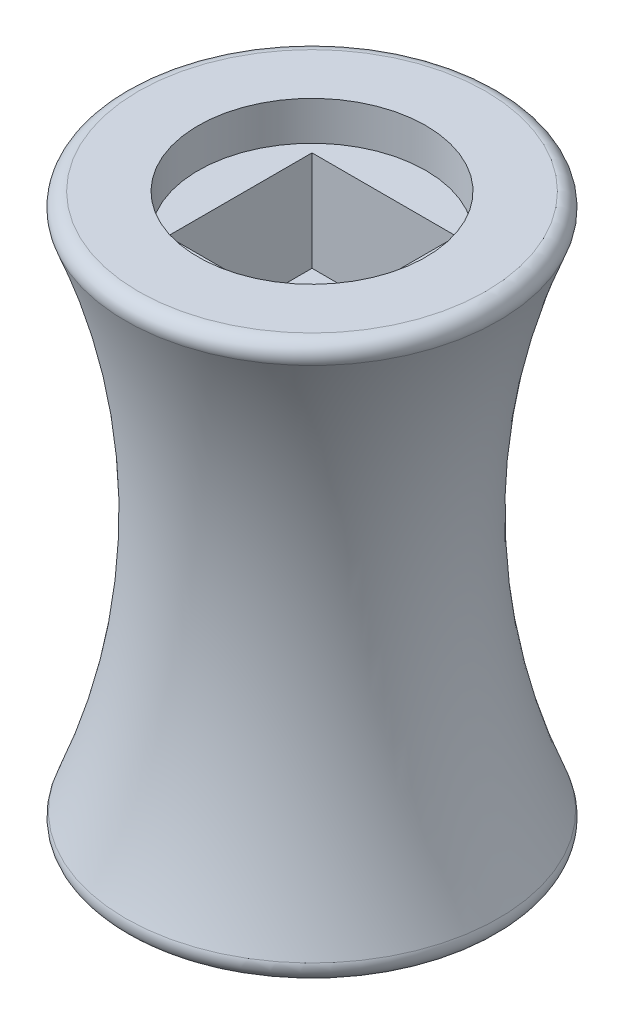
ISO-10303-21;
HEADER;
FILE_DESCRIPTION(('STEP AP214'),'2;1');
FILE_NAME('part.step','',(''),(''),'','','');
FILE_SCHEMA(('AUTOMOTIVE_DESIGN { 1 0 10303 214 1 1 1 1 }'));
ENDSEC;
DATA;
#1=APPLICATION_CONTEXT('core data for automotive mechanical design processes');
#2=APPLICATION_PROTOCOL_DEFINITION('international standard','automotive_design',2000,#1);
#3=PRODUCT_CONTEXT('',#1,'mechanical');
#4=PRODUCT('Part','Part','',(#3));
#5=PRODUCT_RELATED_PRODUCT_CATEGORY('part','',(#4));
#6=PRODUCT_DEFINITION_FORMATION('','',#4);
#7=PRODUCT_DEFINITION_CONTEXT('part definition',#1,'design');
#8=PRODUCT_DEFINITION('design','',#6,#7);
#9=PRODUCT_DEFINITION_SHAPE('','',#8);
#10=(LENGTH_UNIT() NAMED_UNIT(*) SI_UNIT(.MILLI.,.METRE.));
#11=(NAMED_UNIT(*) PLANE_ANGLE_UNIT() SI_UNIT($,.RADIAN.));
#12=(NAMED_UNIT(*) SI_UNIT($,.STERADIAN.) SOLID_ANGLE_UNIT());
#13=UNCERTAINTY_MEASURE_WITH_UNIT(LENGTH_MEASURE(1.E-05),#10,'distance_accuracy_value','');
#14=(GEOMETRIC_REPRESENTATION_CONTEXT(3) GLOBAL_UNCERTAINTY_ASSIGNED_CONTEXT((#13)) GLOBAL_UNIT_ASSIGNED_CONTEXT((#10,
#11,#12)) REPRESENTATION_CONTEXT('',''));
#15=CARTESIAN_POINT('',(0.,0.,0.));
#16=DIRECTION('',(0.,0.,1.));
#17=DIRECTION('',(1.,0.,0.));
#18=AXIS2_PLACEMENT_3D('',#15,#16,#17);
#19=CARTESIAN_POINT('',(3.302,25.4,-3.302));
#20=DIRECTION('',(1.,0.,0.));
#21=DIRECTION('',(0.,0.,-1.));
#22=AXIS2_PLACEMENT_3D('',#19,#20,#21);
#23=PLANE('',#22);
#24=DIRECTION('',(0.,0.,1.));
#25=VECTOR('',#24,1.);
#26=CARTESIAN_POINT('',(3.302,19.05,3.302));
#27=LINE('',#26,#25);
#28=CARTESIAN_POINT('',(3.302,19.05,-3.302));
#29=VERTEX_POINT('',#28);
#30=CARTESIAN_POINT('',(3.302,19.05,3.302));
#31=VERTEX_POINT('',#30);
#32=EDGE_CURVE('E269',#29,#31,#27,.T.);
#33=ORIENTED_EDGE('',*,*,#32,.T.);
#34=DIRECTION('',(0.,-1.,0.));
#35=VECTOR('',#34,1.);
#36=CARTESIAN_POINT('',(3.302,25.4,3.302));
#37=LINE('',#36,#35);
#38=CARTESIAN_POINT('',(3.302,23.622,3.302));
#39=VERTEX_POINT('',#38);
#40=EDGE_CURVE('E139',#39,#31,#37,.T.);
#41=ORIENTED_EDGE('',*,*,#40,.F.);
#42=DIRECTION('',(0.,0.,1.));
#43=VECTOR('',#42,1.);
#44=CARTESIAN_POINT('',(3.302,23.622,-3.302));
#45=LINE('',#44,#43);
#46=CARTESIAN_POINT('',(3.302,23.622,-3.302));
#47=VERTEX_POINT('',#46);
#48=EDGE_CURVE('E244',#47,#39,#45,.T.);
#49=ORIENTED_EDGE('',*,*,#48,.F.);
#50=DIRECTION('',(0.,-1.,0.));
#51=VECTOR('',#50,1.);
#52=CARTESIAN_POINT('',(3.302,25.4,-3.302));
#53=LINE('',#52,#51);
#54=EDGE_CURVE('E152',#47,#29,#53,.T.);
#55=ORIENTED_EDGE('',*,*,#54,.T.);
#56=EDGE_LOOP('',(#33,#41,#49,#55));
#57=FACE_BOUND('',#56,.T.);
#58=ADVANCED_FACE('F43',(#57),#23,.F.);
#59=CARTESIAN_POINT('',(-3.302,25.4,-3.302));
#60=DIRECTION('',(0.,0.,-1.));
#61=DIRECTION('',(-1.,0.,0.));
#62=AXIS2_PLACEMENT_3D('',#59,#60,#61);
#63=PLANE('',#62);
#64=DIRECTION('',(1.,0.,0.));
#65=VECTOR('',#64,1.);
#66=CARTESIAN_POINT('',(-3.302,19.05,-3.302));
#67=LINE('',#66,#65);
#68=CARTESIAN_POINT('',(-3.302,19.05,-3.302));
#69=VERTEX_POINT('',#68);
#70=EDGE_CURVE('E59',#69,#29,#67,.T.);
#71=ORIENTED_EDGE('',*,*,#70,.T.);
#72=ORIENTED_EDGE('',*,*,#54,.F.);
#73=DIRECTION('',(1.,0.,0.));
#74=VECTOR('',#73,1.);
#75=CARTESIAN_POINT('',(-3.302,23.622,-3.302));
#76=LINE('',#75,#74);
#77=CARTESIAN_POINT('',(-3.302,23.622,-3.302));
#78=VERTEX_POINT('',#77);
#79=EDGE_CURVE('E248',#78,#47,#76,.T.);
#80=ORIENTED_EDGE('',*,*,#79,.F.);
#81=DIRECTION('',(0.,-1.,0.));
#82=VECTOR('',#81,1.);
#83=CARTESIAN_POINT('',(-3.302,25.4,-3.302));
#84=LINE('',#83,#82);
#85=EDGE_CURVE('E146',#78,#69,#84,.T.);
#86=ORIENTED_EDGE('',*,*,#85,.T.);
#87=EDGE_LOOP('',(#71,#72,#80,#86));
#88=FACE_BOUND('',#87,.T.);
#89=ADVANCED_FACE('F190',(#88),#63,.F.);
#90=CARTESIAN_POINT('',(-3.302,25.4,-3.302));
#91=DIRECTION('',(-1.,0.,0.));
#92=DIRECTION('',(0.,0.,1.));
#93=AXIS2_PLACEMENT_3D('',#90,#91,#92);
#94=PLANE('',#93);
#95=DIRECTION('',(0.,0.,-1.));
#96=VECTOR('',#95,1.);
#97=CARTESIAN_POINT('',(-3.302,19.05,3.302));
#98=LINE('',#97,#96);
#99=CARTESIAN_POINT('',(-3.302,19.05,3.302));
#100=VERTEX_POINT('',#99);
#101=EDGE_CURVE('E67',#100,#69,#98,.T.);
#102=ORIENTED_EDGE('',*,*,#101,.T.);
#103=ORIENTED_EDGE('',*,*,#85,.F.);
#104=DIRECTION('',(0.,0.,-1.));
#105=VECTOR('',#104,1.);
#106=CARTESIAN_POINT('',(-3.302,23.622,-3.302));
#107=LINE('',#106,#105);
#108=CARTESIAN_POINT('',(-3.302,23.622,3.302));
#109=VERTEX_POINT('',#108);
#110=EDGE_CURVE('E251',#109,#78,#107,.T.);
#111=ORIENTED_EDGE('',*,*,#110,.F.);
#112=DIRECTION('',(0.,-1.,0.));
#113=VECTOR('',#112,1.);
#114=CARTESIAN_POINT('',(-3.302,25.4,3.302));
#115=LINE('',#114,#113);
#116=EDGE_CURVE('E138',#109,#100,#115,.T.);
#117=ORIENTED_EDGE('',*,*,#116,.T.);
#118=EDGE_LOOP('',(#102,#103,#111,#117));
#119=FACE_BOUND('',#118,.T.);
#120=ADVANCED_FACE('F198',(#119),#94,.F.);
#121=CARTESIAN_POINT('',(-3.302,25.4,3.302));
#122=DIRECTION('',(0.,0.,1.));
#123=DIRECTION('',(1.,0.,0.));
#124=AXIS2_PLACEMENT_3D('',#121,#122,#123);
#125=PLANE('',#124);
#126=DIRECTION('',(-1.,0.,0.));
#127=VECTOR('',#126,1.);
#128=CARTESIAN_POINT('',(-3.302,19.05,3.302));
#129=LINE('',#128,#127);
#130=EDGE_CURVE('E266',#31,#100,#129,.T.);
#131=ORIENTED_EDGE('',*,*,#130,.T.);
#132=ORIENTED_EDGE('',*,*,#116,.F.);
#133=DIRECTION('',(-1.,0.,0.));
#134=VECTOR('',#133,1.);
#135=CARTESIAN_POINT('',(-3.302,23.622,3.302));
#136=LINE('',#135,#134);
#137=EDGE_CURVE('E11',#39,#109,#136,.T.);
#138=ORIENTED_EDGE('',*,*,#137,.F.);
#139=ORIENTED_EDGE('',*,*,#40,.T.);
#140=EDGE_LOOP('',(#131,#132,#138,#139));
#141=FACE_BOUND('',#140,.T.);
#142=ADVANCED_FACE('F204',(#141),#125,.F.);
#143=CARTESIAN_POINT('',(3.302,6.35,3.302));
#144=VERTEX_POINT('',#143);
#145=CARTESIAN_POINT('',(3.302,1.778,3.302));
#146=VERTEX_POINT('',#145);
#147=EDGE_CURVE('E143',#144,#146,#37,.T.);
#148=ORIENTED_EDGE('',*,*,#147,.F.);
#149=DIRECTION('',(0.,0.,1.));
#150=VECTOR('',#149,1.);
#151=CARTESIAN_POINT('',(3.302,6.35,3.302));
#152=LINE('',#151,#150);
#153=CARTESIAN_POINT('',(3.302,6.35,-3.302));
#154=VERTEX_POINT('',#153);
#155=EDGE_CURVE('E117',#154,#144,#152,.T.);
#156=ORIENTED_EDGE('',*,*,#155,.F.);
#157=CARTESIAN_POINT('',(3.302,1.778,-3.302));
#158=VERTEX_POINT('',#157);
#159=EDGE_CURVE('E228',#154,#158,#53,.T.);
#160=ORIENTED_EDGE('',*,*,#159,.T.);
#161=DIRECTION('',(0.,0.,-1.));
#162=VECTOR('',#161,1.);
#163=CARTESIAN_POINT('',(3.302,1.778,-3.302));
#164=LINE('',#163,#162);
#165=EDGE_CURVE('E215',#146,#158,#164,.T.);
#166=ORIENTED_EDGE('',*,*,#165,.F.);
#167=EDGE_LOOP('',(#148,#156,#160,#166));
#168=FACE_BOUND('',#167,.T.);
#169=ADVANCED_FACE('F193',(#168),#23,.F.);
#170=ORIENTED_EDGE('',*,*,#159,.F.);
#171=DIRECTION('',(1.,0.,0.));
#172=VECTOR('',#171,1.);
#173=CARTESIAN_POINT('',(-3.302,6.35,-3.302));
#174=LINE('',#173,#172);
#175=CARTESIAN_POINT('',(-3.302,6.35,-3.302));
#176=VERTEX_POINT('',#175);
#177=EDGE_CURVE('E131',#176,#154,#174,.T.);
#178=ORIENTED_EDGE('',*,*,#177,.F.);
#179=CARTESIAN_POINT('',(-3.302,1.778,-3.302));
#180=VERTEX_POINT('',#179);
#181=EDGE_CURVE('E129',#176,#180,#84,.T.);
#182=ORIENTED_EDGE('',*,*,#181,.T.);
#183=DIRECTION('',(-1.,0.,0.));
#184=VECTOR('',#183,1.);
#185=CARTESIAN_POINT('',(-3.302,1.778,-3.302));
#186=LINE('',#185,#184);
#187=EDGE_CURVE('E218',#158,#180,#186,.T.);
#188=ORIENTED_EDGE('',*,*,#187,.F.);
#189=EDGE_LOOP('',(#170,#178,#182,#188));
#190=FACE_BOUND('',#189,.T.);
#191=ADVANCED_FACE('F200',(#190),#63,.F.);
#192=ORIENTED_EDGE('',*,*,#181,.F.);
#193=DIRECTION('',(0.,0.,-1.));
#194=VECTOR('',#193,1.);
#195=CARTESIAN_POINT('',(-3.302,6.35,3.302));
#196=LINE('',#195,#194);
#197=CARTESIAN_POINT('',(-3.302,6.35,3.302));
#198=VERTEX_POINT('',#197);
#199=EDGE_CURVE('E114',#198,#176,#196,.T.);
#200=ORIENTED_EDGE('',*,*,#199,.F.);
#201=CARTESIAN_POINT('',(-3.302,1.778,3.302));
#202=VERTEX_POINT('',#201);
#203=EDGE_CURVE('E127',#198,#202,#115,.T.);
#204=ORIENTED_EDGE('',*,*,#203,.T.);
#205=DIRECTION('',(0.,0.,1.));
#206=VECTOR('',#205,1.);
#207=CARTESIAN_POINT('',(-3.302,1.778,-3.302));
#208=LINE('',#207,#206);
#209=EDGE_CURVE('E224',#180,#202,#208,.T.);
#210=ORIENTED_EDGE('',*,*,#209,.F.);
#211=EDGE_LOOP('',(#192,#200,#204,#210));
#212=FACE_BOUND('',#211,.T.);
#213=ADVANCED_FACE('F125',(#212),#94,.F.);
#214=ORIENTED_EDGE('',*,*,#203,.F.);
#215=DIRECTION('',(-1.,0.,0.));
#216=VECTOR('',#215,1.);
#217=CARTESIAN_POINT('',(-3.302,6.35,3.302));
#218=LINE('',#217,#216);
#219=EDGE_CURVE('E110',#144,#198,#218,.T.);
#220=ORIENTED_EDGE('',*,*,#219,.F.);
#221=ORIENTED_EDGE('',*,*,#147,.T.);
#222=DIRECTION('',(1.,0.,0.));
#223=VECTOR('',#222,1.);
#224=CARTESIAN_POINT('',(-3.302,1.778,3.302));
#225=LINE('',#224,#223);
#226=EDGE_CURVE('E136',#202,#146,#225,.T.);
#227=ORIENTED_EDGE('',*,*,#226,.F.);
#228=EDGE_LOOP('',(#214,#220,#221,#227));
#229=FACE_BOUND('',#228,.T.);
#230=ADVANCED_FACE('F134',(#229),#125,.F.);
#231=CARTESIAN_POINT('',(0.,0.,-2.54));
#232=DIRECTION('',(0.,-1.,0.));
#233=DIRECTION('',(0.,0.,-1.));
#234=AXIS2_PLACEMENT_3D('',#231,#232,#233);
#235=PLANE('',#234);
#236=CARTESIAN_POINT('',(0.,0.,0.));
#237=DIRECTION('',(0.,-1.,0.));
#238=DIRECTION('',(0.,0.,-1.));
#239=AXIS2_PLACEMENT_3D('',#236,#237,#238);
#240=CIRCLE('',#239,7.93567036482353);
#241=CARTESIAN_POINT('',(0.,0.,-7.93567036482353));
#242=VERTEX_POINT('',#241);
#243=EDGE_CURVE('E151',#242,#242,#240,.T.);
#244=ORIENTED_EDGE('',*,*,#243,.T.);
#245=EDGE_LOOP('',(#244));
#246=FACE_BOUND('',#245,.T.);
#247=CARTESIAN_POINT('',(0.,0.,0.));
#248=DIRECTION('',(0.,-1.,0.));
#249=DIRECTION('',(0.,0.,-1.));
#250=AXIS2_PLACEMENT_3D('',#247,#248,#249);
#251=CIRCLE('',#250,5.207);
#252=CARTESIAN_POINT('',(0.,0.,-5.207));
#253=VERTEX_POINT('',#252);
#254=EDGE_CURVE('E239',#253,#253,#251,.T.);
#255=ORIENTED_EDGE('',*,*,#254,.F.);
#256=EDGE_LOOP('',(#255));
#257=FACE_BOUND('',#256,.T.);
#258=ADVANCED_FACE('F177',(#246,#257),#235,.T.);
#259=CARTESIAN_POINT('',(0.,12.7,0.));
#260=DIRECTION('',(0.,-1.,0.));
#261=DIRECTION('',(0.,0.,-1.));
#262=AXIS2_PLACEMENT_3D('',#259,#260,#261);
#263=TOROIDAL_SURFACE('',#262,37.9893556629696,31.75);
#264=CARTESIAN_POINT('',(0.,0.871568627450983,0.));
#265=DIRECTION('',(0.,1.,0.));
#266=DIRECTION('',(0.,0.,1.));
#267=AXIS2_PLACEMENT_3D('',#264,#265,#266);
#268=CIRCLE('',#267,8.524958311846);
#269=CARTESIAN_POINT('',(0.,0.871568627450983,8.524958311846));
#270=VERTEX_POINT('',#269);
#271=EDGE_CURVE('E160',#270,#270,#268,.T.);
#272=ORIENTED_EDGE('',*,*,#271,.T.);
#273=EDGE_LOOP('',(#272));
#274=FACE_BOUND('',#273,.T.);
#275=CARTESIAN_POINT('',(0.,24.528431372549,0.));
#276=DIRECTION('',(0.,-1.,0.));
#277=DIRECTION('',(0.,0.,-1.));
#278=AXIS2_PLACEMENT_3D('',#275,#276,#277);
#279=CIRCLE('',#278,8.52495831184601);
#280=CARTESIAN_POINT('',(0.,24.528431372549,-8.52495831184601));
#281=VERTEX_POINT('',#280);
#282=EDGE_CURVE('E156',#281,#281,#279,.T.);
#283=ORIENTED_EDGE('',*,*,#282,.T.);
#284=EDGE_LOOP('',(#283));
#285=FACE_BOUND('',#284,.T.);
#286=ADVANCED_FACE('F175',(#274,#285),#263,.F.);
#287=CARTESIAN_POINT('',(0.,25.4,-2.54));
#288=DIRECTION('',(0.,1.,0.));
#289=DIRECTION('',(0.,0.,1.));
#290=AXIS2_PLACEMENT_3D('',#287,#288,#289);
#291=PLANE('',#290);
#292=CARTESIAN_POINT('',(0.,25.4,0.));
#293=DIRECTION('',(0.,-1.,0.));
#294=DIRECTION('',(0.,0.,-1.));
#295=AXIS2_PLACEMENT_3D('',#292,#293,#294);
#296=CIRCLE('',#295,5.207);
#297=CARTESIAN_POINT('',(0.,25.4,-5.207));
#298=VERTEX_POINT('',#297);
#299=EDGE_CURVE('E255',#298,#298,#296,.T.);
#300=ORIENTED_EDGE('',*,*,#299,.T.);
#301=EDGE_LOOP('',(#300));
#302=FACE_BOUND('',#301,.T.);
#303=CARTESIAN_POINT('',(0.,25.4,0.));
#304=DIRECTION('',(0.,1.,0.));
#305=DIRECTION('',(0.,0.,1.));
#306=AXIS2_PLACEMENT_3D('',#303,#304,#305);
#307=CIRCLE('',#306,7.93567036482354);
#308=CARTESIAN_POINT('',(0.,25.4,7.93567036482354));
#309=VERTEX_POINT('',#308);
#310=EDGE_CURVE('E52',#309,#309,#307,.T.);
#311=ORIENTED_EDGE('',*,*,#310,.T.);
#312=EDGE_LOOP('',(#311));
#313=FACE_BOUND('',#312,.T.);
#314=ADVANCED_FACE('F167',(#302,#313),#291,.T.);
#315=CARTESIAN_POINT('',(0.,1.778,0.));
#316=DIRECTION('',(0.,-1.,0.));
#317=DIRECTION('',(0.,0.,-1.));
#318=AXIS2_PLACEMENT_3D('',#315,#316,#317);
#319=PLANE('',#318);
#320=CARTESIAN_POINT('',(0.,1.778,0.));
#321=DIRECTION('',(0.,-1.,0.));
#322=DIRECTION('',(0.,0.,-1.));
#323=AXIS2_PLACEMENT_3D('',#320,#321,#322);
#324=CIRCLE('',#323,5.207);
#325=CARTESIAN_POINT('',(0.,1.778,-5.207));
#326=VERTEX_POINT('',#325);
#327=EDGE_CURVE('E236',#326,#326,#324,.T.);
#328=ORIENTED_EDGE('',*,*,#327,.T.);
#329=EDGE_LOOP('',(#328));
#330=FACE_BOUND('',#329,.T.);
#331=ORIENTED_EDGE('',*,*,#165,.T.);
#332=ORIENTED_EDGE('',*,*,#187,.T.);
#333=ORIENTED_EDGE('',*,*,#209,.T.);
#334=ORIENTED_EDGE('',*,*,#226,.T.);
#335=EDGE_LOOP('',(#331,#332,#333,#334));
#336=FACE_BOUND('',#335,.T.);
#337=ADVANCED_FACE('F184',(#330,#336),#319,.T.);
#338=CARTESIAN_POINT('',(0.,1.778,0.));
#339=DIRECTION('',(0.,-1.,0.));
#340=DIRECTION('',(0.,0.,-1.));
#341=AXIS2_PLACEMENT_3D('',#338,#339,#340);
#342=CYLINDRICAL_SURFACE('',#341,5.207);
#343=ORIENTED_EDGE('',*,*,#327,.F.);
#344=EDGE_LOOP('',(#343));
#345=FACE_BOUND('',#344,.T.);
#346=ORIENTED_EDGE('',*,*,#254,.T.);
#347=EDGE_LOOP('',(#346));
#348=FACE_BOUND('',#347,.T.);
#349=ADVANCED_FACE('F307',(#345,#348),#342,.F.);
#350=CARTESIAN_POINT('',(0.,0.635000000000004,0.));
#351=DIRECTION('',(0.,1.,0.));
#352=DIRECTION('',(0.,0.,1.));
#353=AXIS2_PLACEMENT_3D('',#350,#351,#352);
#354=TOROIDAL_SURFACE('',#353,7.93567036482353,0.635);
#355=ORIENTED_EDGE('',*,*,#271,.F.);
#356=EDGE_LOOP('',(#355));
#357=FACE_BOUND('',#356,.T.);
#358=ORIENTED_EDGE('',*,*,#243,.F.);
#359=EDGE_LOOP('',(#358));
#360=FACE_BOUND('',#359,.T.);
#361=ADVANCED_FACE('F172',(#357,#360),#354,.T.);
#362=CARTESIAN_POINT('',(0.,24.765,0.));
#363=DIRECTION('',(0.,-1.,0.));
#364=DIRECTION('',(0.,0.,-1.));
#365=AXIS2_PLACEMENT_3D('',#362,#363,#364);
#366=TOROIDAL_SURFACE('',#365,7.93567036482354,0.635);
#367=ORIENTED_EDGE('',*,*,#310,.F.);
#368=EDGE_LOOP('',(#367));
#369=FACE_BOUND('',#368,.T.);
#370=ORIENTED_EDGE('',*,*,#282,.F.);
#371=EDGE_LOOP('',(#370));
#372=FACE_BOUND('',#371,.T.);
#373=ADVANCED_FACE('F45',(#369,#372),#366,.T.);
#374=CARTESIAN_POINT('',(0.,23.622,0.));
#375=DIRECTION('',(0.,1.,0.));
#376=DIRECTION('',(0.,0.,-1.));
#377=AXIS2_PLACEMENT_3D('',#374,#375,#376);
#378=PLANE('',#377);
#379=CARTESIAN_POINT('',(0.,23.622,0.));
#380=DIRECTION('',(0.,-1.,0.));
#381=DIRECTION('',(0.,0.,-1.));
#382=AXIS2_PLACEMENT_3D('',#379,#380,#381);
#383=CIRCLE('',#382,5.207);
#384=CARTESIAN_POINT('',(0.,23.622,-5.207));
#385=VERTEX_POINT('',#384);
#386=EDGE_CURVE('E254',#385,#385,#383,.T.);
#387=ORIENTED_EDGE('',*,*,#386,.F.);
#388=EDGE_LOOP('',(#387));
#389=FACE_BOUND('',#388,.T.);
#390=ORIENTED_EDGE('',*,*,#48,.T.);
#391=ORIENTED_EDGE('',*,*,#137,.T.);
#392=ORIENTED_EDGE('',*,*,#110,.T.);
#393=ORIENTED_EDGE('',*,*,#79,.T.);
#394=EDGE_LOOP('',(#390,#391,#392,#393));
#395=FACE_BOUND('',#394,.T.);
#396=ADVANCED_FACE('F171',(#389,#395),#378,.T.);
#397=CARTESIAN_POINT('',(0.,23.622,0.));
#398=DIRECTION('',(0.,1.,0.));
#399=DIRECTION('',(0.,0.,1.));
#400=AXIS2_PLACEMENT_3D('',#397,#398,#399);
#401=CYLINDRICAL_SURFACE('',#400,5.207);
#402=ORIENTED_EDGE('',*,*,#386,.T.);
#403=EDGE_LOOP('',(#402));
#404=FACE_BOUND('',#403,.T.);
#405=ORIENTED_EDGE('',*,*,#299,.F.);
#406=EDGE_LOOP('',(#405));
#407=FACE_BOUND('',#406,.T.);
#408=ADVANCED_FACE('F289',(#404,#407),#401,.F.);
#409=CARTESIAN_POINT('',(0.,6.35,0.));
#410=DIRECTION('',(0.,-1.,0.));
#411=DIRECTION('',(0.,0.,-1.));
#412=AXIS2_PLACEMENT_3D('',#409,#410,#411);
#413=PLANE('',#412);
#414=ORIENTED_EDGE('',*,*,#155,.T.);
#415=ORIENTED_EDGE('',*,*,#219,.T.);
#416=ORIENTED_EDGE('',*,*,#199,.T.);
#417=ORIENTED_EDGE('',*,*,#177,.T.);
#418=EDGE_LOOP('',(#414,#415,#416,#417));
#419=FACE_BOUND('',#418,.T.);
#420=CARTESIAN_POINT('',(0.,6.35,0.));
#421=DIRECTION('',(0.,-1.,0.));
#422=DIRECTION('',(0.,0.,-1.));
#423=AXIS2_PLACEMENT_3D('',#420,#421,#422);
#424=CIRCLE('',#423,2.54);
#425=CARTESIAN_POINT('',(0.,6.35,-2.54));
#426=VERTEX_POINT('',#425);
#427=EDGE_CURVE('E272',#426,#426,#424,.T.);
#428=ORIENTED_EDGE('',*,*,#427,.F.);
#429=EDGE_LOOP('',(#428));
#430=FACE_BOUND('',#429,.T.);
#431=ADVANCED_FACE('F112',(#419,#430),#413,.T.);
#432=CARTESIAN_POINT('',(0.,19.05,0.));
#433=DIRECTION('',(0.,-1.,0.));
#434=DIRECTION('',(0.,0.,-1.));
#435=AXIS2_PLACEMENT_3D('',#432,#433,#434);
#436=PLANE('',#435);
#437=ORIENTED_EDGE('',*,*,#32,.F.);
#438=ORIENTED_EDGE('',*,*,#70,.F.);
#439=ORIENTED_EDGE('',*,*,#101,.F.);
#440=ORIENTED_EDGE('',*,*,#130,.F.);
#441=EDGE_LOOP('',(#437,#438,#439,#440));
#442=FACE_BOUND('',#441,.T.);
#443=CARTESIAN_POINT('',(0.,19.05,0.));
#444=DIRECTION('',(0.,-1.,0.));
#445=DIRECTION('',(0.,0.,-1.));
#446=AXIS2_PLACEMENT_3D('',#443,#444,#445);
#447=CIRCLE('',#446,2.54);
#448=CARTESIAN_POINT('',(0.,19.05,-2.54));
#449=VERTEX_POINT('',#448);
#450=EDGE_CURVE('E277',#449,#449,#447,.T.);
#451=ORIENTED_EDGE('',*,*,#450,.T.);
#452=EDGE_LOOP('',(#451));
#453=FACE_BOUND('',#452,.T.);
#454=ADVANCED_FACE('F288',(#442,#453),#436,.F.);
#455=CARTESIAN_POINT('',(0.,6.35,0.));
#456=DIRECTION('',(0.,1.,0.));
#457=DIRECTION('',(0.,0.,1.));
#458=AXIS2_PLACEMENT_3D('',#455,#456,#457);
#459=CYLINDRICAL_SURFACE('',#458,2.54);
#460=ORIENTED_EDGE('',*,*,#427,.T.);
#461=EDGE_LOOP('',(#460));
#462=FACE_BOUND('',#461,.T.);
#463=ORIENTED_EDGE('',*,*,#450,.F.);
#464=EDGE_LOOP('',(#463));
#465=FACE_BOUND('',#464,.T.);
#466=ADVANCED_FACE('F285',(#462,#465),#459,.F.);
#467=CLOSED_SHELL('',(#58,#89,#120,#142,#169,#191,#213,#230,#258,#286,#314,#337,#349,#361,#373,
#396,#408,#431,#454,#466));
#468=MANIFOLD_SOLID_BREP('B2',#467);
#469=ADVANCED_BREP_SHAPE_REPRESENTATION('',(#18,#468),#14);
#470=SHAPE_DEFINITION_REPRESENTATION(#9,#469);
ENDSEC;
END-ISO-10303-21;
